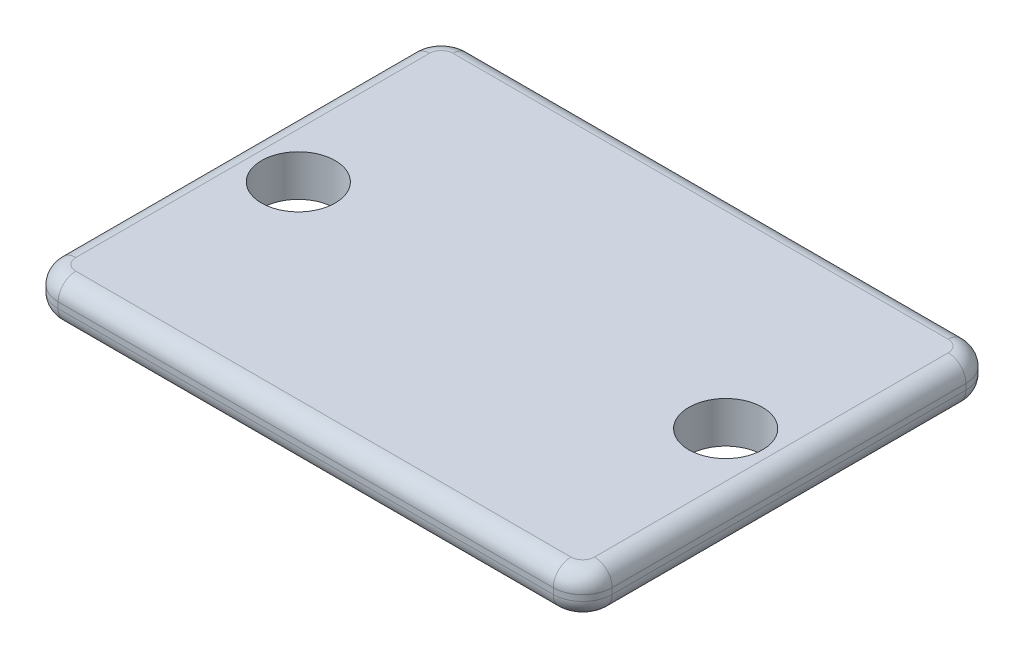
ISO-10303-21;
HEADER;
FILE_DESCRIPTION(('STEP AP214'),'2;1');
FILE_NAME('part.step','',(''),(''),'','','');
FILE_SCHEMA(('AUTOMOTIVE_DESIGN { 1 0 10303 214 1 1 1 1 }'));
ENDSEC;
DATA;
#1=APPLICATION_CONTEXT('core data for automotive mechanical design processes');
#2=APPLICATION_PROTOCOL_DEFINITION('international standard','automotive_design',2000,#1);
#3=PRODUCT_CONTEXT('',#1,'mechanical');
#4=PRODUCT('Part','Part','',(#3));
#5=PRODUCT_RELATED_PRODUCT_CATEGORY('part','',(#4));
#6=PRODUCT_DEFINITION_FORMATION('','',#4);
#7=PRODUCT_DEFINITION_CONTEXT('part definition',#1,'design');
#8=PRODUCT_DEFINITION('design','',#6,#7);
#9=PRODUCT_DEFINITION_SHAPE('','',#8);
#10=(LENGTH_UNIT() NAMED_UNIT(*) SI_UNIT(.MILLI.,.METRE.));
#11=(NAMED_UNIT(*) PLANE_ANGLE_UNIT() SI_UNIT($,.RADIAN.));
#12=(NAMED_UNIT(*) SI_UNIT($,.STERADIAN.) SOLID_ANGLE_UNIT());
#13=UNCERTAINTY_MEASURE_WITH_UNIT(LENGTH_MEASURE(1.E-05),#10,'distance_accuracy_value','');
#14=(GEOMETRIC_REPRESENTATION_CONTEXT(3) GLOBAL_UNCERTAINTY_ASSIGNED_CONTEXT((#13)) GLOBAL_UNIT_ASSIGNED_CONTEXT((#10,
#11,#12)) REPRESENTATION_CONTEXT('',''));
#15=CARTESIAN_POINT('',(0.,0.,0.));
#16=DIRECTION('',(0.,0.,1.));
#17=DIRECTION('',(1.,0.,0.));
#18=AXIS2_PLACEMENT_3D('',#15,#16,#17);
#19=CARTESIAN_POINT('',(0.,1.4,0.));
#20=DIRECTION('',(0.,1.,0.));
#21=DIRECTION('',(0.,0.,1.));
#22=AXIS2_PLACEMENT_3D('',#19,#20,#21);
#23=PLANE('',#22);
#24=CARTESIAN_POINT('',(8.4,1.4,6.));
#25=DIRECTION('',(0.,1.,0.));
#26=DIRECTION('',(0.,0.,1.));
#27=AXIS2_PLACEMENT_3D('',#24,#25,#26);
#28=CIRCLE('',#27,0.4);
#29=CARTESIAN_POINT('',(8.4,1.4,6.4));
#30=VERTEX_POINT('',#29);
#31=CARTESIAN_POINT('',(8.8,1.4,6.));
#32=VERTEX_POINT('',#31);
#33=EDGE_CURVE('E56',#30,#32,#28,.T.);
#34=ORIENTED_EDGE('',*,*,#33,.T.);
#35=DIRECTION('',(0.,0.,-1.));
#36=VECTOR('',#35,1.);
#37=CARTESIAN_POINT('',(8.8,1.4,-6.));
#38=LINE('',#37,#36);
#39=CARTESIAN_POINT('',(8.8,1.4,-6.));
#40=VERTEX_POINT('',#39);
#41=EDGE_CURVE('E51',#32,#40,#38,.T.);
#42=ORIENTED_EDGE('',*,*,#41,.T.);
#43=CARTESIAN_POINT('',(8.4,1.4,-6.));
#44=DIRECTION('',(0.,1.,0.));
#45=DIRECTION('',(0.,0.,1.));
#46=AXIS2_PLACEMENT_3D('',#43,#44,#45);
#47=CIRCLE('',#46,0.4);
#48=CARTESIAN_POINT('',(8.4,1.4,-6.4));
#49=VERTEX_POINT('',#48);
#50=EDGE_CURVE('E220',#40,#49,#47,.T.);
#51=ORIENTED_EDGE('',*,*,#50,.T.);
#52=DIRECTION('',(-1.,0.,0.));
#53=VECTOR('',#52,1.);
#54=CARTESIAN_POINT('',(-8.4,1.4,-6.4));
#55=LINE('',#54,#53);
#56=CARTESIAN_POINT('',(-8.4,1.4,-6.4));
#57=VERTEX_POINT('',#56);
#58=EDGE_CURVE('E215',#49,#57,#55,.T.);
#59=ORIENTED_EDGE('',*,*,#58,.T.);
#60=CARTESIAN_POINT('',(-8.4,1.4,-6.));
#61=DIRECTION('',(0.,1.,0.));
#62=DIRECTION('',(0.,0.,1.));
#63=AXIS2_PLACEMENT_3D('',#60,#61,#62);
#64=CIRCLE('',#63,0.4);
#65=CARTESIAN_POINT('',(-8.8,1.4,-6.));
#66=VERTEX_POINT('',#65);
#67=EDGE_CURVE('E212',#57,#66,#64,.T.);
#68=ORIENTED_EDGE('',*,*,#67,.T.);
#69=DIRECTION('',(0.,0.,1.));
#70=VECTOR('',#69,1.);
#71=CARTESIAN_POINT('',(-8.8,1.4,6.));
#72=LINE('',#71,#70);
#73=CARTESIAN_POINT('',(-8.8,1.4,6.));
#74=VERTEX_POINT('',#73);
#75=EDGE_CURVE('E208',#66,#74,#72,.T.);
#76=ORIENTED_EDGE('',*,*,#75,.T.);
#77=CARTESIAN_POINT('',(-8.4,1.4,6.));
#78=DIRECTION('',(0.,1.,0.));
#79=DIRECTION('',(0.,0.,1.));
#80=AXIS2_PLACEMENT_3D('',#77,#78,#79);
#81=CIRCLE('',#80,0.4);
#82=CARTESIAN_POINT('',(-8.4,1.4,6.4));
#83=VERTEX_POINT('',#82);
#84=EDGE_CURVE('E210',#74,#83,#81,.T.);
#85=ORIENTED_EDGE('',*,*,#84,.T.);
#86=DIRECTION('',(1.,0.,0.));
#87=VECTOR('',#86,1.);
#88=CARTESIAN_POINT('',(8.4,1.4,6.4));
#89=LINE('',#88,#87);
#90=EDGE_CURVE('E217',#83,#30,#89,.T.);
#91=ORIENTED_EDGE('',*,*,#90,.T.);
#92=EDGE_LOOP('',(#34,#42,#51,#59,#68,#76,#85,#91));
#93=FACE_BOUND('',#92,.T.);
#94=CARTESIAN_POINT('',(-7.25,1.4,0.));
#95=DIRECTION('',(0.,1.,0.));
#96=DIRECTION('',(0.,0.,1.));
#97=AXIS2_PLACEMENT_3D('',#94,#95,#96);
#98=CIRCLE('',#97,1.25);
#99=CARTESIAN_POINT('',(-7.25,1.4,1.25));
#100=VERTEX_POINT('',#99);
#101=EDGE_CURVE('E294',#100,#100,#98,.T.);
#102=ORIENTED_EDGE('',*,*,#101,.F.);
#103=EDGE_LOOP('',(#102));
#104=FACE_BOUND('',#103,.T.);
#105=CARTESIAN_POINT('',(7.25,1.4,0.));
#106=DIRECTION('',(0.,1.,0.));
#107=DIRECTION('',(0.,0.,1.));
#108=AXIS2_PLACEMENT_3D('',#105,#106,#107);
#109=CIRCLE('',#108,1.25);
#110=CARTESIAN_POINT('',(7.25,1.4,1.25));
#111=VERTEX_POINT('',#110);
#112=EDGE_CURVE('E612',#111,#111,#109,.T.);
#113=ORIENTED_EDGE('',*,*,#112,.F.);
#114=EDGE_LOOP('',(#113));
#115=FACE_BOUND('',#114,.T.);
#116=ADVANCED_FACE('F34',(#93,#104,#115),#23,.T.);
#117=CARTESIAN_POINT('',(0.,0.,0.));
#118=DIRECTION('',(0.,1.,0.));
#119=DIRECTION('',(0.,0.,1.));
#120=AXIS2_PLACEMENT_3D('',#117,#118,#119);
#121=PLANE('',#120);
#122=CARTESIAN_POINT('',(8.4,0.,-6.));
#123=DIRECTION('',(0.,1.,0.));
#124=DIRECTION('',(0.,0.,1.));
#125=AXIS2_PLACEMENT_3D('',#122,#123,#124);
#126=CIRCLE('',#125,0.4);
#127=CARTESIAN_POINT('',(8.4,0.,-6.4));
#128=VERTEX_POINT('',#127);
#129=CARTESIAN_POINT('',(8.8,0.,-6.));
#130=VERTEX_POINT('',#129);
#131=EDGE_CURVE('E187',#128,#130,#126,.F.);
#132=ORIENTED_EDGE('',*,*,#131,.T.);
#133=DIRECTION('',(0.,0.,-1.));
#134=VECTOR('',#133,1.);
#135=CARTESIAN_POINT('',(8.8,0.,0.));
#136=LINE('',#135,#134);
#137=CARTESIAN_POINT('',(8.8,0.,6.));
#138=VERTEX_POINT('',#137);
#139=EDGE_CURVE('E189',#130,#138,#136,.F.);
#140=ORIENTED_EDGE('',*,*,#139,.T.);
#141=CARTESIAN_POINT('',(8.4,0.,6.));
#142=DIRECTION('',(0.,1.,0.));
#143=DIRECTION('',(0.,0.,1.));
#144=AXIS2_PLACEMENT_3D('',#141,#142,#143);
#145=CIRCLE('',#144,0.4);
#146=CARTESIAN_POINT('',(8.4,0.,6.4));
#147=VERTEX_POINT('',#146);
#148=EDGE_CURVE('E185',#138,#147,#145,.F.);
#149=ORIENTED_EDGE('',*,*,#148,.T.);
#150=DIRECTION('',(1.,0.,0.));
#151=VECTOR('',#150,1.);
#152=CARTESIAN_POINT('',(0.,0.,6.4));
#153=LINE('',#152,#151);
#154=CARTESIAN_POINT('',(-8.4,0.,6.4));
#155=VERTEX_POINT('',#154);
#156=EDGE_CURVE('E155',#147,#155,#153,.F.);
#157=ORIENTED_EDGE('',*,*,#156,.T.);
#158=CARTESIAN_POINT('',(-8.4,0.,6.));
#159=DIRECTION('',(0.,1.,0.));
#160=DIRECTION('',(0.,0.,1.));
#161=AXIS2_PLACEMENT_3D('',#158,#159,#160);
#162=CIRCLE('',#161,0.4);
#163=CARTESIAN_POINT('',(-8.8,0.,6.));
#164=VERTEX_POINT('',#163);
#165=EDGE_CURVE('E146',#155,#164,#162,.F.);
#166=ORIENTED_EDGE('',*,*,#165,.T.);
#167=DIRECTION('',(0.,0.,1.));
#168=VECTOR('',#167,1.);
#169=CARTESIAN_POINT('',(-8.8,0.,0.));
#170=LINE('',#169,#168);
#171=CARTESIAN_POINT('',(-8.8,0.,-6.));
#172=VERTEX_POINT('',#171);
#173=EDGE_CURVE('E152',#164,#172,#170,.F.);
#174=ORIENTED_EDGE('',*,*,#173,.T.);
#175=CARTESIAN_POINT('',(-8.4,0.,-6.));
#176=DIRECTION('',(0.,1.,0.));
#177=DIRECTION('',(0.,0.,1.));
#178=AXIS2_PLACEMENT_3D('',#175,#176,#177);
#179=CIRCLE('',#178,0.4);
#180=CARTESIAN_POINT('',(-8.4,0.,-6.4));
#181=VERTEX_POINT('',#180);
#182=EDGE_CURVE('E159',#172,#181,#179,.F.);
#183=ORIENTED_EDGE('',*,*,#182,.T.);
#184=DIRECTION('',(-1.,0.,0.));
#185=VECTOR('',#184,1.);
#186=CARTESIAN_POINT('',(0.,0.,-6.4));
#187=LINE('',#186,#185);
#188=EDGE_CURVE('E182',#181,#128,#187,.F.);
#189=ORIENTED_EDGE('',*,*,#188,.T.);
#190=EDGE_LOOP('',(#132,#140,#149,#157,#166,#174,#183,#189));
#191=FACE_BOUND('',#190,.T.);
#192=CARTESIAN_POINT('',(-7.25,0.,0.));
#193=DIRECTION('',(0.,1.,0.));
#194=DIRECTION('',(0.,0.,1.));
#195=AXIS2_PLACEMENT_3D('',#192,#193,#194);
#196=CIRCLE('',#195,1.25);
#197=CARTESIAN_POINT('',(-7.25,0.,1.25));
#198=VERTEX_POINT('',#197);
#199=EDGE_CURVE('E299',#198,#198,#196,.T.);
#200=ORIENTED_EDGE('',*,*,#199,.T.);
#201=EDGE_LOOP('',(#200));
#202=FACE_BOUND('',#201,.T.);
#203=CARTESIAN_POINT('',(7.25,0.,0.));
#204=DIRECTION('',(0.,1.,0.));
#205=DIRECTION('',(0.,0.,1.));
#206=AXIS2_PLACEMENT_3D('',#203,#204,#205);
#207=CIRCLE('',#206,1.25);
#208=CARTESIAN_POINT('',(7.25,0.,1.25));
#209=VERTEX_POINT('',#208);
#210=EDGE_CURVE('E251',#209,#209,#207,.T.);
#211=ORIENTED_EDGE('',*,*,#210,.T.);
#212=EDGE_LOOP('',(#211));
#213=FACE_BOUND('',#212,.T.);
#214=ADVANCED_FACE('F148',(#191,#202,#213),#121,.F.);
#215=CARTESIAN_POINT('',(-9.4,1.4,7.));
#216=DIRECTION('',(1.,0.,0.));
#217=DIRECTION('',(0.,0.,-1.));
#218=AXIS2_PLACEMENT_3D('',#215,#216,#217);
#219=PLANE('',#218);
#220=DIRECTION('',(0.,-1.,0.));
#221=VECTOR('',#220,1.);
#222=CARTESIAN_POINT('',(-9.4,1.4,-6.));
#223=LINE('',#222,#221);
#224=CARTESIAN_POINT('',(-9.4,0.8,-6.));
#225=VERTEX_POINT('',#224);
#226=CARTESIAN_POINT('',(-9.4,0.6,-6.));
#227=VERTEX_POINT('',#226);
#228=EDGE_CURVE('E296',#225,#227,#223,.T.);
#229=ORIENTED_EDGE('',*,*,#228,.T.);
#230=DIRECTION('',(0.,0.,1.));
#231=VECTOR('',#230,1.);
#232=CARTESIAN_POINT('',(-9.4,0.6,7.));
#233=LINE('',#232,#231);
#234=CARTESIAN_POINT('',(-9.4,0.6,6.));
#235=VERTEX_POINT('',#234);
#236=EDGE_CURVE('E11',#227,#235,#233,.T.);
#237=ORIENTED_EDGE('',*,*,#236,.T.);
#238=DIRECTION('',(0.,-1.,0.));
#239=VECTOR('',#238,1.);
#240=CARTESIAN_POINT('',(-9.4,1.4,6.));
#241=LINE('',#240,#239);
#242=CARTESIAN_POINT('',(-9.4,0.8,6.));
#243=VERTEX_POINT('',#242);
#244=EDGE_CURVE('E305',#235,#243,#241,.F.);
#245=ORIENTED_EDGE('',*,*,#244,.T.);
#246=DIRECTION('',(0.,0.,1.));
#247=VECTOR('',#246,1.);
#248=CARTESIAN_POINT('',(-9.4,0.8,-6.));
#249=LINE('',#248,#247);
#250=EDGE_CURVE('E43',#243,#225,#249,.F.);
#251=ORIENTED_EDGE('',*,*,#250,.T.);
#252=EDGE_LOOP('',(#229,#237,#245,#251));
#253=FACE_BOUND('',#252,.T.);
#254=ADVANCED_FACE('F359',(#253),#219,.F.);
#255=CARTESIAN_POINT('',(9.4,1.4,7.));
#256=DIRECTION('',(0.,0.,-1.));
#257=DIRECTION('',(-1.,0.,0.));
#258=AXIS2_PLACEMENT_3D('',#255,#256,#257);
#259=PLANE('',#258);
#260=DIRECTION('',(0.,-1.,0.));
#261=VECTOR('',#260,1.);
#262=CARTESIAN_POINT('',(-8.4,1.4,7.));
#263=LINE('',#262,#261);
#264=CARTESIAN_POINT('',(-8.4,0.8,7.));
#265=VERTEX_POINT('',#264);
#266=CARTESIAN_POINT('',(-8.4,0.6,7.));
#267=VERTEX_POINT('',#266);
#268=EDGE_CURVE('E293',#265,#267,#263,.T.);
#269=ORIENTED_EDGE('',*,*,#268,.T.);
#270=DIRECTION('',(1.,0.,0.));
#271=VECTOR('',#270,1.);
#272=CARTESIAN_POINT('',(9.4,0.6,7.));
#273=LINE('',#272,#271);
#274=CARTESIAN_POINT('',(8.4,0.6,7.));
#275=VERTEX_POINT('',#274);
#276=EDGE_CURVE('E225',#267,#275,#273,.T.);
#277=ORIENTED_EDGE('',*,*,#276,.T.);
#278=DIRECTION('',(0.,-1.,0.));
#279=VECTOR('',#278,1.);
#280=CARTESIAN_POINT('',(8.4,1.4,7.));
#281=LINE('',#280,#279);
#282=CARTESIAN_POINT('',(8.4,0.8,7.));
#283=VERTEX_POINT('',#282);
#284=EDGE_CURVE('E284',#275,#283,#281,.F.);
#285=ORIENTED_EDGE('',*,*,#284,.T.);
#286=DIRECTION('',(1.,0.,0.));
#287=VECTOR('',#286,1.);
#288=CARTESIAN_POINT('',(-8.4,0.8,7.));
#289=LINE('',#288,#287);
#290=EDGE_CURVE('E223',#283,#265,#289,.F.);
#291=ORIENTED_EDGE('',*,*,#290,.T.);
#292=EDGE_LOOP('',(#269,#277,#285,#291));
#293=FACE_BOUND('',#292,.T.);
#294=ADVANCED_FACE('F290',(#293),#259,.F.);
#295=CARTESIAN_POINT('',(9.4,1.4,7.));
#296=DIRECTION('',(-1.,0.,0.));
#297=DIRECTION('',(0.,0.,1.));
#298=AXIS2_PLACEMENT_3D('',#295,#296,#297);
#299=PLANE('',#298);
#300=DIRECTION('',(0.,-1.,0.));
#301=VECTOR('',#300,1.);
#302=CARTESIAN_POINT('',(9.4,1.4,6.));
#303=LINE('',#302,#301);
#304=CARTESIAN_POINT('',(9.4,0.8,6.));
#305=VERTEX_POINT('',#304);
#306=CARTESIAN_POINT('',(9.4,0.6,6.));
#307=VERTEX_POINT('',#306);
#308=EDGE_CURVE('E287',#305,#307,#303,.T.);
#309=ORIENTED_EDGE('',*,*,#308,.T.);
#310=DIRECTION('',(0.,0.,-1.));
#311=VECTOR('',#310,1.);
#312=CARTESIAN_POINT('',(9.4,0.6,7.));
#313=LINE('',#312,#311);
#314=CARTESIAN_POINT('',(9.4,0.6,-6.));
#315=VERTEX_POINT('',#314);
#316=EDGE_CURVE('E229',#307,#315,#313,.T.);
#317=ORIENTED_EDGE('',*,*,#316,.T.);
#318=DIRECTION('',(0.,-1.,0.));
#319=VECTOR('',#318,1.);
#320=CARTESIAN_POINT('',(9.4,1.4,-6.));
#321=LINE('',#320,#319);
#322=CARTESIAN_POINT('',(9.4,0.8,-6.));
#323=VERTEX_POINT('',#322);
#324=EDGE_CURVE('E308',#315,#323,#321,.F.);
#325=ORIENTED_EDGE('',*,*,#324,.T.);
#326=DIRECTION('',(0.,0.,-1.));
#327=VECTOR('',#326,1.);
#328=CARTESIAN_POINT('',(9.4,0.8,6.));
#329=LINE('',#328,#327);
#330=EDGE_CURVE('E227',#323,#305,#329,.F.);
#331=ORIENTED_EDGE('',*,*,#330,.T.);
#332=EDGE_LOOP('',(#309,#317,#325,#331));
#333=FACE_BOUND('',#332,.T.);
#334=ADVANCED_FACE('F368',(#333),#299,.F.);
#335=CARTESIAN_POINT('',(9.4,1.4,-7.));
#336=DIRECTION('',(0.,0.,1.));
#337=DIRECTION('',(1.,0.,0.));
#338=AXIS2_PLACEMENT_3D('',#335,#336,#337);
#339=PLANE('',#338);
#340=DIRECTION('',(0.,-1.,0.));
#341=VECTOR('',#340,1.);
#342=CARTESIAN_POINT('',(8.4,1.4,-7.));
#343=LINE('',#342,#341);
#344=CARTESIAN_POINT('',(8.4,0.8,-7.));
#345=VERTEX_POINT('',#344);
#346=CARTESIAN_POINT('',(8.4,0.6,-7.));
#347=VERTEX_POINT('',#346);
#348=EDGE_CURVE('E174',#345,#347,#343,.T.);
#349=ORIENTED_EDGE('',*,*,#348,.T.);
#350=DIRECTION('',(-1.,0.,0.));
#351=VECTOR('',#350,1.);
#352=CARTESIAN_POINT('',(9.4,0.6,-7.));
#353=LINE('',#352,#351);
#354=CARTESIAN_POINT('',(-8.4,0.6,-7.));
#355=VERTEX_POINT('',#354);
#356=EDGE_CURVE('E233',#347,#355,#353,.T.);
#357=ORIENTED_EDGE('',*,*,#356,.T.);
#358=DIRECTION('',(0.,-1.,0.));
#359=VECTOR('',#358,1.);
#360=CARTESIAN_POINT('',(-8.4,1.4,-7.));
#361=LINE('',#360,#359);
#362=CARTESIAN_POINT('',(-8.4,0.8,-7.));
#363=VERTEX_POINT('',#362);
#364=EDGE_CURVE('E177',#355,#363,#361,.F.);
#365=ORIENTED_EDGE('',*,*,#364,.T.);
#366=DIRECTION('',(-1.,0.,0.));
#367=VECTOR('',#366,1.);
#368=CARTESIAN_POINT('',(8.4,0.8,-7.));
#369=LINE('',#368,#367);
#370=EDGE_CURVE('E231',#363,#345,#369,.F.);
#371=ORIENTED_EDGE('',*,*,#370,.T.);
#372=EDGE_LOOP('',(#349,#357,#365,#371));
#373=FACE_BOUND('',#372,.T.);
#374=ADVANCED_FACE('F314',(#373),#339,.F.);
#375=CARTESIAN_POINT('',(-7.25,1.4,0.));
#376=DIRECTION('',(0.,-1.,0.));
#377=DIRECTION('',(0.,0.,-1.));
#378=AXIS2_PLACEMENT_3D('',#375,#376,#377);
#379=CYLINDRICAL_SURFACE('',#378,1.25);
#380=ORIENTED_EDGE('',*,*,#101,.T.);
#381=EDGE_LOOP('',(#380));
#382=FACE_BOUND('',#381,.T.);
#383=ORIENTED_EDGE('',*,*,#199,.F.);
#384=EDGE_LOOP('',(#383));
#385=FACE_BOUND('',#384,.T.);
#386=ADVANCED_FACE('F363',(#382,#385),#379,.F.);
#387=CARTESIAN_POINT('',(7.25,1.4,0.));
#388=DIRECTION('',(0.,-1.,0.));
#389=DIRECTION('',(0.,0.,-1.));
#390=AXIS2_PLACEMENT_3D('',#387,#388,#389);
#391=CYLINDRICAL_SURFACE('',#390,1.25);
#392=ORIENTED_EDGE('',*,*,#112,.T.);
#393=EDGE_LOOP('',(#392));
#394=FACE_BOUND('',#393,.T.);
#395=ORIENTED_EDGE('',*,*,#210,.F.);
#396=EDGE_LOOP('',(#395));
#397=FACE_BOUND('',#396,.T.);
#398=ADVANCED_FACE('F380',(#394,#397),#391,.F.);
#399=CARTESIAN_POINT('',(-8.4,1.4,6.));
#400=DIRECTION('',(0.,-1.,0.));
#401=DIRECTION('',(0.,0.,-1.));
#402=AXIS2_PLACEMENT_3D('',#399,#400,#401);
#403=CYLINDRICAL_SURFACE('',#402,1.);
#404=ORIENTED_EDGE('',*,*,#244,.F.);
#405=CARTESIAN_POINT('',(-8.4,0.6,6.));
#406=DIRECTION('',(0.,1.,0.));
#407=DIRECTION('',(0.,0.,1.));
#408=AXIS2_PLACEMENT_3D('',#405,#406,#407);
#409=CIRCLE('',#408,1.);
#410=EDGE_CURVE('E165',#235,#267,#409,.T.);
#411=ORIENTED_EDGE('',*,*,#410,.T.);
#412=ORIENTED_EDGE('',*,*,#268,.F.);
#413=CARTESIAN_POINT('',(-8.4,0.8,6.));
#414=DIRECTION('',(0.,1.,0.));
#415=DIRECTION('',(0.,0.,1.));
#416=AXIS2_PLACEMENT_3D('',#413,#414,#415);
#417=CIRCLE('',#416,1.);
#418=EDGE_CURVE('E205',#265,#243,#417,.F.);
#419=ORIENTED_EDGE('',*,*,#418,.T.);
#420=EDGE_LOOP('',(#404,#411,#412,#419));
#421=FACE_BOUND('',#420,.T.);
#422=ADVANCED_FACE('F377',(#421),#403,.T.);
#423=CARTESIAN_POINT('',(8.4,1.4,6.));
#424=DIRECTION('',(0.,-1.,0.));
#425=DIRECTION('',(0.,0.,-1.));
#426=AXIS2_PLACEMENT_3D('',#423,#424,#425);
#427=CYLINDRICAL_SURFACE('',#426,1.);
#428=ORIENTED_EDGE('',*,*,#284,.F.);
#429=CARTESIAN_POINT('',(8.4,0.6,6.));
#430=DIRECTION('',(0.,1.,0.));
#431=DIRECTION('',(0.,0.,1.));
#432=AXIS2_PLACEMENT_3D('',#429,#430,#431);
#433=CIRCLE('',#432,1.);
#434=EDGE_CURVE('E203',#275,#307,#433,.T.);
#435=ORIENTED_EDGE('',*,*,#434,.T.);
#436=ORIENTED_EDGE('',*,*,#308,.F.);
#437=CARTESIAN_POINT('',(8.4,0.8,6.));
#438=DIRECTION('',(0.,1.,0.));
#439=DIRECTION('',(0.,0.,1.));
#440=AXIS2_PLACEMENT_3D('',#437,#438,#439);
#441=CIRCLE('',#440,1.);
#442=EDGE_CURVE('E201',#305,#283,#441,.F.);
#443=ORIENTED_EDGE('',*,*,#442,.T.);
#444=EDGE_LOOP('',(#428,#435,#436,#443));
#445=FACE_BOUND('',#444,.T.);
#446=ADVANCED_FACE('F283',(#445),#427,.T.);
#447=CARTESIAN_POINT('',(8.4,1.4,-6.));
#448=DIRECTION('',(0.,-1.,0.));
#449=DIRECTION('',(0.,0.,-1.));
#450=AXIS2_PLACEMENT_3D('',#447,#448,#449);
#451=CYLINDRICAL_SURFACE('',#450,1.);
#452=ORIENTED_EDGE('',*,*,#324,.F.);
#453=CARTESIAN_POINT('',(8.4,0.6,-6.));
#454=DIRECTION('',(0.,1.,0.));
#455=DIRECTION('',(0.,0.,1.));
#456=AXIS2_PLACEMENT_3D('',#453,#454,#455);
#457=CIRCLE('',#456,1.);
#458=EDGE_CURVE('E199',#315,#347,#457,.T.);
#459=ORIENTED_EDGE('',*,*,#458,.T.);
#460=ORIENTED_EDGE('',*,*,#348,.F.);
#461=CARTESIAN_POINT('',(8.4,0.8,-6.));
#462=DIRECTION('',(0.,1.,0.));
#463=DIRECTION('',(0.,0.,1.));
#464=AXIS2_PLACEMENT_3D('',#461,#462,#463);
#465=CIRCLE('',#464,1.);
#466=EDGE_CURVE('E197',#345,#323,#465,.F.);
#467=ORIENTED_EDGE('',*,*,#466,.T.);
#468=EDGE_LOOP('',(#452,#459,#460,#467));
#469=FACE_BOUND('',#468,.T.);
#470=ADVANCED_FACE('F384',(#469),#451,.T.);
#471=CARTESIAN_POINT('',(-8.4,1.4,-6.));
#472=DIRECTION('',(0.,-1.,0.));
#473=DIRECTION('',(0.,0.,-1.));
#474=AXIS2_PLACEMENT_3D('',#471,#472,#473);
#475=CYLINDRICAL_SURFACE('',#474,1.);
#476=ORIENTED_EDGE('',*,*,#364,.F.);
#477=CARTESIAN_POINT('',(-8.4,0.6,-6.));
#478=DIRECTION('',(0.,1.,0.));
#479=DIRECTION('',(0.,0.,1.));
#480=AXIS2_PLACEMENT_3D('',#477,#478,#479);
#481=CIRCLE('',#480,1.);
#482=EDGE_CURVE('E194',#355,#227,#481,.T.);
#483=ORIENTED_EDGE('',*,*,#482,.T.);
#484=ORIENTED_EDGE('',*,*,#228,.F.);
#485=CARTESIAN_POINT('',(-8.4,0.8,-6.));
#486=DIRECTION('',(0.,1.,0.));
#487=DIRECTION('',(0.,0.,1.));
#488=AXIS2_PLACEMENT_3D('',#485,#486,#487);
#489=CIRCLE('',#488,1.);
#490=EDGE_CURVE('E191',#225,#363,#489,.F.);
#491=ORIENTED_EDGE('',*,*,#490,.T.);
#492=EDGE_LOOP('',(#476,#483,#484,#491));
#493=FACE_BOUND('',#492,.T.);
#494=ADVANCED_FACE('F320',(#493),#475,.T.);
#495=CARTESIAN_POINT('',(8.4,0.6,6.));
#496=DIRECTION('',(0.,1.,0.));
#497=DIRECTION('',(0.,0.,1.));
#498=AXIS2_PLACEMENT_3D('',#495,#496,#497);
#499=DEGENERATE_TOROIDAL_SURFACE('',#498,0.4,0.6,.T.);
#500=CARTESIAN_POINT('',(8.8,0.6,6.));
#501=DIRECTION('',(0.,0.,-1.));
#502=DIRECTION('',(-1.,0.,0.));
#503=AXIS2_PLACEMENT_3D('',#500,#501,#502);
#504=CIRCLE('',#503,0.6);
#505=EDGE_CURVE('E245',#307,#138,#504,.T.);
#506=ORIENTED_EDGE('',*,*,#505,.F.);
#507=ORIENTED_EDGE('',*,*,#434,.F.);
#508=CARTESIAN_POINT('',(8.4,0.6,6.4));
#509=DIRECTION('',(-1.,0.,0.));
#510=DIRECTION('',(0.,0.,1.));
#511=AXIS2_PLACEMENT_3D('',#508,#509,#510);
#512=CIRCLE('',#511,0.6);
#513=EDGE_CURVE('E248',#147,#275,#512,.T.);
#514=ORIENTED_EDGE('',*,*,#513,.F.);
#515=ORIENTED_EDGE('',*,*,#148,.F.);
#516=EDGE_LOOP('',(#506,#507,#514,#515));
#517=FACE_BOUND('',#516,.T.);
#518=ADVANCED_FACE('F343',(#517),#499,.T.);
#519=CARTESIAN_POINT('',(9.4,0.6,6.4));
#520=DIRECTION('',(1.,0.,0.));
#521=DIRECTION('',(0.,0.,-1.));
#522=AXIS2_PLACEMENT_3D('',#519,#520,#521);
#523=CYLINDRICAL_SURFACE('',#522,0.6);
#524=ORIENTED_EDGE('',*,*,#513,.T.);
#525=ORIENTED_EDGE('',*,*,#276,.F.);
#526=CARTESIAN_POINT('',(-8.4,0.6,6.4));
#527=DIRECTION('',(-1.,0.,0.));
#528=DIRECTION('',(0.,0.,1.));
#529=AXIS2_PLACEMENT_3D('',#526,#527,#528);
#530=CIRCLE('',#529,0.6);
#531=EDGE_CURVE('E243',#155,#267,#530,.T.);
#532=ORIENTED_EDGE('',*,*,#531,.F.);
#533=ORIENTED_EDGE('',*,*,#156,.F.);
#534=EDGE_LOOP('',(#524,#525,#532,#533));
#535=FACE_BOUND('',#534,.T.);
#536=ADVANCED_FACE('F345',(#535),#523,.T.);
#537=CARTESIAN_POINT('',(8.8,0.6,7.));
#538=DIRECTION('',(0.,0.,-1.));
#539=DIRECTION('',(-1.,0.,0.));
#540=AXIS2_PLACEMENT_3D('',#537,#538,#539);
#541=CYLINDRICAL_SURFACE('',#540,0.6);
#542=ORIENTED_EDGE('',*,*,#505,.T.);
#543=ORIENTED_EDGE('',*,*,#139,.F.);
#544=CARTESIAN_POINT('',(8.8,0.6,-6.));
#545=DIRECTION('',(0.,0.,-1.));
#546=DIRECTION('',(0.,1.,0.));
#547=AXIS2_PLACEMENT_3D('',#544,#545,#546);
#548=CIRCLE('',#547,0.6);
#549=EDGE_CURVE('E168',#315,#130,#548,.T.);
#550=ORIENTED_EDGE('',*,*,#549,.F.);
#551=ORIENTED_EDGE('',*,*,#316,.F.);
#552=EDGE_LOOP('',(#542,#543,#550,#551));
#553=FACE_BOUND('',#552,.T.);
#554=ADVANCED_FACE('F338',(#553),#541,.T.);
#555=CARTESIAN_POINT('',(-8.4,0.6,6.));
#556=DIRECTION('',(0.,1.,0.));
#557=DIRECTION('',(0.,0.,1.));
#558=AXIS2_PLACEMENT_3D('',#555,#556,#557);
#559=DEGENERATE_TOROIDAL_SURFACE('',#558,0.4,0.6,.T.);
#560=ORIENTED_EDGE('',*,*,#531,.T.);
#561=ORIENTED_EDGE('',*,*,#410,.F.);
#562=CARTESIAN_POINT('',(-8.8,0.6,6.));
#563=DIRECTION('',(0.,0.,-1.));
#564=DIRECTION('',(-1.,0.,0.));
#565=AXIS2_PLACEMENT_3D('',#562,#563,#564);
#566=CIRCLE('',#565,0.6);
#567=EDGE_CURVE('E163',#164,#235,#566,.T.);
#568=ORIENTED_EDGE('',*,*,#567,.F.);
#569=ORIENTED_EDGE('',*,*,#165,.F.);
#570=EDGE_LOOP('',(#560,#561,#568,#569));
#571=FACE_BOUND('',#570,.T.);
#572=ADVANCED_FACE('F164',(#571),#559,.T.);
#573=CARTESIAN_POINT('',(8.4,0.6,-6.));
#574=DIRECTION('',(0.,1.,0.));
#575=DIRECTION('',(0.,0.,1.));
#576=AXIS2_PLACEMENT_3D('',#573,#574,#575);
#577=DEGENERATE_TOROIDAL_SURFACE('',#576,0.4,0.6,.T.);
#578=ORIENTED_EDGE('',*,*,#549,.T.);
#579=ORIENTED_EDGE('',*,*,#131,.F.);
#580=CARTESIAN_POINT('',(8.4,0.6,-6.4));
#581=DIRECTION('',(-1.,0.,0.));
#582=DIRECTION('',(0.,0.,1.));
#583=AXIS2_PLACEMENT_3D('',#580,#581,#582);
#584=CIRCLE('',#583,0.6);
#585=EDGE_CURVE('E169',#347,#128,#584,.T.);
#586=ORIENTED_EDGE('',*,*,#585,.F.);
#587=ORIENTED_EDGE('',*,*,#458,.F.);
#588=EDGE_LOOP('',(#578,#579,#586,#587));
#589=FACE_BOUND('',#588,.T.);
#590=ADVANCED_FACE('F333',(#589),#577,.T.);
#591=CARTESIAN_POINT('',(-8.8,0.6,7.));
#592=DIRECTION('',(0.,0.,1.));
#593=DIRECTION('',(1.,0.,0.));
#594=AXIS2_PLACEMENT_3D('',#591,#592,#593);
#595=CYLINDRICAL_SURFACE('',#594,0.6);
#596=ORIENTED_EDGE('',*,*,#567,.T.);
#597=ORIENTED_EDGE('',*,*,#236,.F.);
#598=CARTESIAN_POINT('',(-8.8,0.6,-6.));
#599=DIRECTION('',(0.,0.,-1.));
#600=DIRECTION('',(-1.,0.,0.));
#601=AXIS2_PLACEMENT_3D('',#598,#599,#600);
#602=CIRCLE('',#601,0.6);
#603=EDGE_CURVE('E172',#172,#227,#602,.T.);
#604=ORIENTED_EDGE('',*,*,#603,.F.);
#605=ORIENTED_EDGE('',*,*,#173,.F.);
#606=EDGE_LOOP('',(#596,#597,#604,#605));
#607=FACE_BOUND('',#606,.T.);
#608=ADVANCED_FACE('F171',(#607),#595,.T.);
#609=CARTESIAN_POINT('',(9.4,0.6,-6.4));
#610=DIRECTION('',(-1.,0.,0.));
#611=DIRECTION('',(0.,0.,1.));
#612=AXIS2_PLACEMENT_3D('',#609,#610,#611);
#613=CYLINDRICAL_SURFACE('',#612,0.6);
#614=ORIENTED_EDGE('',*,*,#585,.T.);
#615=ORIENTED_EDGE('',*,*,#188,.F.);
#616=CARTESIAN_POINT('',(-8.4,0.6,-6.4));
#617=DIRECTION('',(-1.,0.,0.));
#618=DIRECTION('',(0.,-1.,0.));
#619=AXIS2_PLACEMENT_3D('',#616,#617,#618);
#620=CIRCLE('',#619,0.6);
#621=EDGE_CURVE('E236',#355,#181,#620,.T.);
#622=ORIENTED_EDGE('',*,*,#621,.F.);
#623=ORIENTED_EDGE('',*,*,#356,.F.);
#624=EDGE_LOOP('',(#614,#615,#622,#623));
#625=FACE_BOUND('',#624,.T.);
#626=ADVANCED_FACE('F328',(#625),#613,.T.);
#627=CARTESIAN_POINT('',(-8.4,0.6,-6.));
#628=DIRECTION('',(0.,1.,0.));
#629=DIRECTION('',(0.,0.,1.));
#630=AXIS2_PLACEMENT_3D('',#627,#628,#629);
#631=DEGENERATE_TOROIDAL_SURFACE('',#630,0.4,0.6,.T.);
#632=ORIENTED_EDGE('',*,*,#603,.T.);
#633=ORIENTED_EDGE('',*,*,#482,.F.);
#634=ORIENTED_EDGE('',*,*,#621,.T.);
#635=ORIENTED_EDGE('',*,*,#182,.F.);
#636=EDGE_LOOP('',(#632,#633,#634,#635));
#637=FACE_BOUND('',#636,.T.);
#638=ADVANCED_FACE('F325',(#637),#631,.T.);
#639=CARTESIAN_POINT('',(8.4,0.8,6.));
#640=DIRECTION('',(0.,1.,0.));
#641=DIRECTION('',(0.,0.,1.));
#642=AXIS2_PLACEMENT_3D('',#639,#640,#641);
#643=DEGENERATE_TOROIDAL_SURFACE('',#642,0.4,0.6,.T.);
#644=CARTESIAN_POINT('',(8.4,0.8,6.4));
#645=DIRECTION('',(-1.,0.,0.));
#646=DIRECTION('',(0.,0.,1.));
#647=AXIS2_PLACEMENT_3D('',#644,#645,#646);
#648=CIRCLE('',#647,0.6);
#649=EDGE_CURVE('E267',#283,#30,#648,.T.);
#650=ORIENTED_EDGE('',*,*,#649,.F.);
#651=ORIENTED_EDGE('',*,*,#442,.F.);
#652=CARTESIAN_POINT('',(8.8,0.8,6.));
#653=DIRECTION('',(0.,0.,-1.));
#654=DIRECTION('',(-1.,0.,0.));
#655=AXIS2_PLACEMENT_3D('',#652,#653,#654);
#656=CIRCLE('',#655,0.6);
#657=EDGE_CURVE('E38',#32,#305,#656,.T.);
#658=ORIENTED_EDGE('',*,*,#657,.F.);
#659=ORIENTED_EDGE('',*,*,#33,.F.);
#660=EDGE_LOOP('',(#650,#651,#658,#659));
#661=FACE_BOUND('',#660,.T.);
#662=ADVANCED_FACE('F36',(#661),#643,.T.);
#663=CARTESIAN_POINT('',(8.8,0.8,0.));
#664=DIRECTION('',(0.,0.,1.));
#665=DIRECTION('',(1.,0.,0.));
#666=AXIS2_PLACEMENT_3D('',#663,#664,#665);
#667=CYLINDRICAL_SURFACE('',#666,0.6);
#668=ORIENTED_EDGE('',*,*,#657,.T.);
#669=ORIENTED_EDGE('',*,*,#330,.F.);
#670=CARTESIAN_POINT('',(8.8,0.8,-6.));
#671=DIRECTION('',(0.,0.,-1.));
#672=DIRECTION('',(-1.,0.,0.));
#673=AXIS2_PLACEMENT_3D('',#670,#671,#672);
#674=CIRCLE('',#673,0.6);
#675=EDGE_CURVE('E265',#40,#323,#674,.T.);
#676=ORIENTED_EDGE('',*,*,#675,.F.);
#677=ORIENTED_EDGE('',*,*,#41,.F.);
#678=EDGE_LOOP('',(#668,#669,#676,#677));
#679=FACE_BOUND('',#678,.T.);
#680=ADVANCED_FACE('F276',(#679),#667,.T.);
#681=CARTESIAN_POINT('',(0.,0.8,6.4));
#682=DIRECTION('',(-1.,0.,0.));
#683=DIRECTION('',(0.,0.,1.));
#684=AXIS2_PLACEMENT_3D('',#681,#682,#683);
#685=CYLINDRICAL_SURFACE('',#684,0.6);
#686=ORIENTED_EDGE('',*,*,#649,.T.);
#687=ORIENTED_EDGE('',*,*,#90,.F.);
#688=CARTESIAN_POINT('',(-8.4,0.8,6.4));
#689=DIRECTION('',(-1.,0.,0.));
#690=DIRECTION('',(0.,0.,1.));
#691=AXIS2_PLACEMENT_3D('',#688,#689,#690);
#692=CIRCLE('',#691,0.6);
#693=EDGE_CURVE('E262',#265,#83,#692,.T.);
#694=ORIENTED_EDGE('',*,*,#693,.F.);
#695=ORIENTED_EDGE('',*,*,#290,.F.);
#696=EDGE_LOOP('',(#686,#687,#694,#695));
#697=FACE_BOUND('',#696,.T.);
#698=ADVANCED_FACE('F430',(#697),#685,.T.);
#699=CARTESIAN_POINT('',(8.4,0.8,-6.));
#700=DIRECTION('',(0.,1.,0.));
#701=DIRECTION('',(0.,0.,1.));
#702=AXIS2_PLACEMENT_3D('',#699,#700,#701);
#703=DEGENERATE_TOROIDAL_SURFACE('',#702,0.4,0.6,.T.);
#704=ORIENTED_EDGE('',*,*,#675,.T.);
#705=ORIENTED_EDGE('',*,*,#466,.F.);
#706=CARTESIAN_POINT('',(8.4,0.8,-6.4));
#707=DIRECTION('',(-1.,0.,0.));
#708=DIRECTION('',(0.,0.,1.));
#709=AXIS2_PLACEMENT_3D('',#706,#707,#708);
#710=CIRCLE('',#709,0.6);
#711=EDGE_CURVE('E259',#49,#345,#710,.T.);
#712=ORIENTED_EDGE('',*,*,#711,.F.);
#713=ORIENTED_EDGE('',*,*,#50,.F.);
#714=EDGE_LOOP('',(#704,#705,#712,#713));
#715=FACE_BOUND('',#714,.T.);
#716=ADVANCED_FACE('F436',(#715),#703,.T.);
#717=CARTESIAN_POINT('',(-8.4,0.8,6.));
#718=DIRECTION('',(0.,1.,0.));
#719=DIRECTION('',(0.,0.,1.));
#720=AXIS2_PLACEMENT_3D('',#717,#718,#719);
#721=DEGENERATE_TOROIDAL_SURFACE('',#720,0.4,0.6,.T.);
#722=ORIENTED_EDGE('',*,*,#693,.T.);
#723=ORIENTED_EDGE('',*,*,#84,.F.);
#724=CARTESIAN_POINT('',(-8.8,0.8,6.));
#725=DIRECTION('',(0.,0.,-1.));
#726=DIRECTION('',(-1.,0.,0.));
#727=AXIS2_PLACEMENT_3D('',#724,#725,#726);
#728=CIRCLE('',#727,0.6);
#729=EDGE_CURVE('E256',#243,#74,#728,.T.);
#730=ORIENTED_EDGE('',*,*,#729,.F.);
#731=ORIENTED_EDGE('',*,*,#418,.F.);
#732=EDGE_LOOP('',(#722,#723,#730,#731));
#733=FACE_BOUND('',#732,.T.);
#734=ADVANCED_FACE('F443',(#733),#721,.T.);
#735=CARTESIAN_POINT('',(0.,0.8,-6.4));
#736=DIRECTION('',(1.,0.,0.));
#737=DIRECTION('',(0.,0.,-1.));
#738=AXIS2_PLACEMENT_3D('',#735,#736,#737);
#739=CYLINDRICAL_SURFACE('',#738,0.6);
#740=ORIENTED_EDGE('',*,*,#711,.T.);
#741=ORIENTED_EDGE('',*,*,#370,.F.);
#742=CARTESIAN_POINT('',(-8.4,0.8,-6.4));
#743=DIRECTION('',(-1.,0.,0.));
#744=DIRECTION('',(0.,0.,1.));
#745=AXIS2_PLACEMENT_3D('',#742,#743,#744);
#746=CIRCLE('',#745,0.6);
#747=EDGE_CURVE('E254',#57,#363,#746,.T.);
#748=ORIENTED_EDGE('',*,*,#747,.F.);
#749=ORIENTED_EDGE('',*,*,#58,.F.);
#750=EDGE_LOOP('',(#740,#741,#748,#749));
#751=FACE_BOUND('',#750,.T.);
#752=ADVANCED_FACE('F451',(#751),#739,.T.);
#753=CARTESIAN_POINT('',(-8.8,0.8,0.));
#754=DIRECTION('',(0.,0.,-1.));
#755=DIRECTION('',(-1.,0.,0.));
#756=AXIS2_PLACEMENT_3D('',#753,#754,#755);
#757=CYLINDRICAL_SURFACE('',#756,0.6);
#758=ORIENTED_EDGE('',*,*,#729,.T.);
#759=ORIENTED_EDGE('',*,*,#75,.F.);
#760=CARTESIAN_POINT('',(-8.8,0.8,-6.));
#761=DIRECTION('',(0.,0.,-1.));
#762=DIRECTION('',(-1.,0.,0.));
#763=AXIS2_PLACEMENT_3D('',#760,#761,#762);
#764=CIRCLE('',#763,0.6);
#765=EDGE_CURVE('E252',#225,#66,#764,.T.);
#766=ORIENTED_EDGE('',*,*,#765,.F.);
#767=ORIENTED_EDGE('',*,*,#250,.F.);
#768=EDGE_LOOP('',(#758,#759,#766,#767));
#769=FACE_BOUND('',#768,.T.);
#770=ADVANCED_FACE('F459',(#769),#757,.T.);
#771=CARTESIAN_POINT('',(-8.4,0.8,-6.));
#772=DIRECTION('',(0.,1.,0.));
#773=DIRECTION('',(0.,0.,1.));
#774=AXIS2_PLACEMENT_3D('',#771,#772,#773);
#775=DEGENERATE_TOROIDAL_SURFACE('',#774,0.4,0.6,.T.);
#776=ORIENTED_EDGE('',*,*,#747,.T.);
#777=ORIENTED_EDGE('',*,*,#490,.F.);
#778=ORIENTED_EDGE('',*,*,#765,.T.);
#779=ORIENTED_EDGE('',*,*,#67,.F.);
#780=EDGE_LOOP('',(#776,#777,#778,#779));
#781=FACE_BOUND('',#780,.T.);
#782=ADVANCED_FACE('F467',(#781),#775,.T.);
#783=CLOSED_SHELL('',(#116,#214,#254,#294,#334,#374,#386,#398,#422,#446,#470,#494,#518,#536,
#554,#572,#590,#608,#626,#638,#662,#680,#698,#716,#734,#752,#770,#782));
#784=MANIFOLD_SOLID_BREP('B2',#783);
#785=ADVANCED_BREP_SHAPE_REPRESENTATION('',(#18,#784),#14);
#786=SHAPE_DEFINITION_REPRESENTATION(#9,#785);
ENDSEC;
END-ISO-10303-21;
